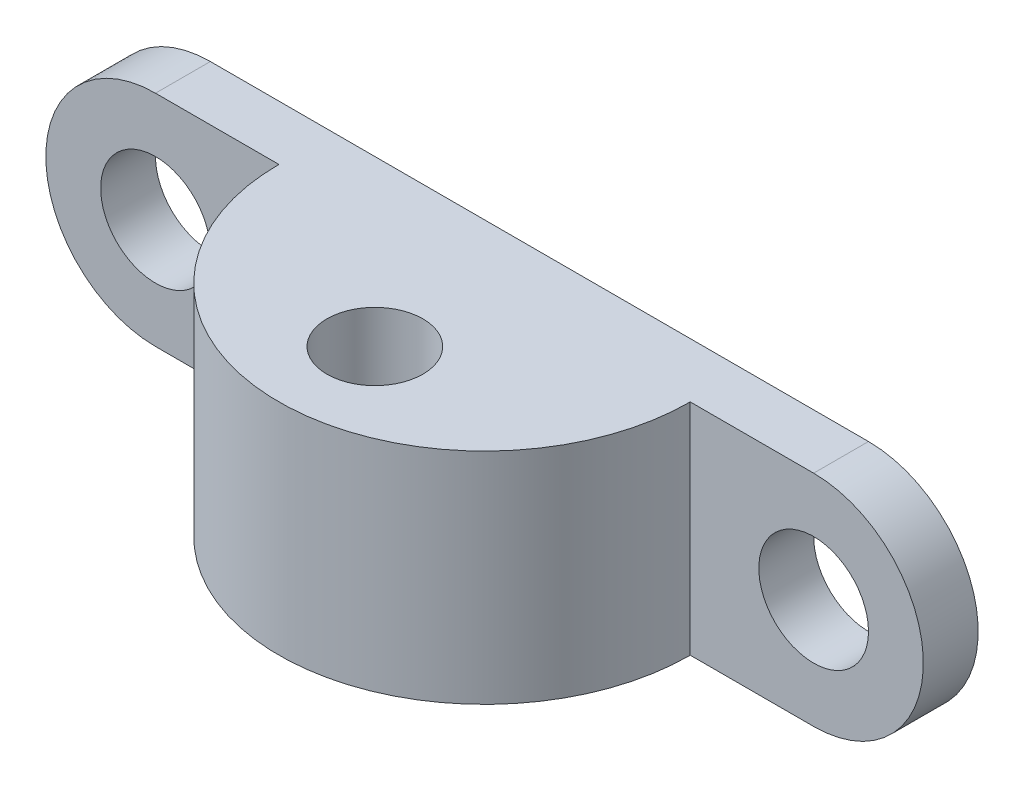
ISO-10303-21;
HEADER;
FILE_DESCRIPTION(('STEP AP214'),'2;1');
FILE_NAME('part.step','',(''),(''),'','','');
FILE_SCHEMA(('AUTOMOTIVE_DESIGN { 1 0 10303 214 1 1 1 1 }'));
ENDSEC;
DATA;
#1=APPLICATION_CONTEXT('core data for automotive mechanical design processes');
#2=APPLICATION_PROTOCOL_DEFINITION('international standard','automotive_design',2000,#1);
#3=PRODUCT_CONTEXT('',#1,'mechanical');
#4=PRODUCT('Part','Part','',(#3));
#5=PRODUCT_RELATED_PRODUCT_CATEGORY('part','',(#4));
#6=PRODUCT_DEFINITION_FORMATION('','',#4);
#7=PRODUCT_DEFINITION_CONTEXT('part definition',#1,'design');
#8=PRODUCT_DEFINITION('design','',#6,#7);
#9=PRODUCT_DEFINITION_SHAPE('','',#8);
#10=(LENGTH_UNIT() NAMED_UNIT(*) SI_UNIT(.MILLI.,.METRE.));
#11=(NAMED_UNIT(*) PLANE_ANGLE_UNIT() SI_UNIT($,.RADIAN.));
#12=(NAMED_UNIT(*) SI_UNIT($,.STERADIAN.) SOLID_ANGLE_UNIT());
#13=UNCERTAINTY_MEASURE_WITH_UNIT(LENGTH_MEASURE(1.E-05),#10,'distance_accuracy_value','');
#14=(GEOMETRIC_REPRESENTATION_CONTEXT(3) GLOBAL_UNCERTAINTY_ASSIGNED_CONTEXT((#13)) GLOBAL_UNIT_ASSIGNED_CONTEXT((#10,
#11,#12)) REPRESENTATION_CONTEXT('',''));
#15=CARTESIAN_POINT('',(0.,0.,0.));
#16=DIRECTION('',(0.,0.,1.));
#17=DIRECTION('',(1.,0.,0.));
#18=AXIS2_PLACEMENT_3D('',#15,#16,#17);
#19=CARTESIAN_POINT('',(0.,0.,2.));
#20=DIRECTION('',(0.,0.,1.));
#21=DIRECTION('',(1.,0.,0.));
#22=AXIS2_PLACEMENT_3D('',#19,#20,#21);
#23=PLANE('',#22);
#24=CARTESIAN_POINT('',(0.,0.,2.));
#25=DIRECTION('',(0.,0.,1.));
#26=DIRECTION('',(1.,0.,0.));
#27=AXIS2_PLACEMENT_3D('',#24,#25,#26);
#28=CIRCLE('',#27,2.);
#29=CARTESIAN_POINT('',(2.,0.,2.));
#30=VERTEX_POINT('',#29);
#31=EDGE_CURVE('E218',#30,#30,#28,.T.);
#32=ORIENTED_EDGE('',*,*,#31,.F.);
#33=EDGE_LOOP('',(#32));
#34=FACE_BOUND('',#33,.T.);
#35=CARTESIAN_POINT('',(0.,0.,2.));
#36=DIRECTION('',(0.,0.,1.));
#37=DIRECTION('',(1.,0.,0.));
#38=AXIS2_PLACEMENT_3D('',#35,#36,#37);
#39=CIRCLE('',#38,4.);
#40=CARTESIAN_POINT('',(0.,4.,2.));
#41=VERTEX_POINT('',#40);
#42=CARTESIAN_POINT('',(0.,-4.,2.));
#43=VERTEX_POINT('',#42);
#44=EDGE_CURVE('E173',#41,#43,#39,.T.);
#45=ORIENTED_EDGE('',*,*,#44,.T.);
#46=DIRECTION('',(1.,0.,0.));
#47=VECTOR('',#46,1.);
#48=CARTESIAN_POINT('',(0.,-4.,2.));
#49=LINE('',#48,#47);
#50=CARTESIAN_POINT('',(4.5,-4.,2.));
#51=VERTEX_POINT('',#50);
#52=EDGE_CURVE('E141',#43,#51,#49,.T.);
#53=ORIENTED_EDGE('',*,*,#52,.T.);
#54=DIRECTION('',(0.,-1.,0.));
#55=VECTOR('',#54,1.);
#56=CARTESIAN_POINT('',(4.5,29.8118189982806,2.));
#57=LINE('',#56,#55);
#58=CARTESIAN_POINT('',(4.5,4.,2.));
#59=VERTEX_POINT('',#58);
#60=EDGE_CURVE('E129',#59,#51,#57,.T.);
#61=ORIENTED_EDGE('',*,*,#60,.F.);
#62=DIRECTION('',(1.,0.,0.));
#63=VECTOR('',#62,1.);
#64=CARTESIAN_POINT('',(0.,4.,2.));
#65=LINE('',#64,#63);
#66=EDGE_CURVE('E140',#41,#59,#65,.T.);
#67=ORIENTED_EDGE('',*,*,#66,.F.);
#68=EDGE_LOOP('',(#45,#53,#61,#67));
#69=FACE_BOUND('',#68,.T.);
#70=ADVANCED_FACE('F71',(#34,#69),#23,.T.);
#71=CARTESIAN_POINT('',(0.,-4.,2.));
#72=DIRECTION('',(0.,1.,0.));
#73=DIRECTION('',(0.,0.,1.));
#74=AXIS2_PLACEMENT_3D('',#71,#72,#73);
#75=PLANE('',#74);
#76=DIRECTION('',(1.,0.,0.));
#77=VECTOR('',#76,1.);
#78=CARTESIAN_POINT('',(0.,-4.,0.));
#79=LINE('',#78,#77);
#80=CARTESIAN_POINT('',(0.,-4.,0.));
#81=VERTEX_POINT('',#80);
#82=CARTESIAN_POINT('',(24.,-4.,0.));
#83=VERTEX_POINT('',#82);
#84=EDGE_CURVE('E161',#81,#83,#79,.T.);
#85=ORIENTED_EDGE('',*,*,#84,.T.);
#86=DIRECTION('',(0.,0.,-1.));
#87=VECTOR('',#86,1.);
#88=CARTESIAN_POINT('',(24.,-4.,2.));
#89=LINE('',#88,#87);
#90=CARTESIAN_POINT('',(24.,-4.,2.));
#91=VERTEX_POINT('',#90);
#92=EDGE_CURVE('E80',#91,#83,#89,.T.);
#93=ORIENTED_EDGE('',*,*,#92,.F.);
#94=CARTESIAN_POINT('',(19.5,-4.,2.));
#95=VERTEX_POINT('',#94);
#96=EDGE_CURVE('E193',#95,#91,#49,.T.);
#97=ORIENTED_EDGE('',*,*,#96,.F.);
#98=CARTESIAN_POINT('',(12.,-4.,2.));
#99=DIRECTION('',(0.,-1.,0.));
#100=DIRECTION('',(0.,0.,-1.));
#101=AXIS2_PLACEMENT_3D('',#98,#99,#100);
#102=CIRCLE('',#101,7.5);
#103=EDGE_CURVE('E143',#95,#51,#102,.T.);
#104=ORIENTED_EDGE('',*,*,#103,.T.);
#105=ORIENTED_EDGE('',*,*,#52,.F.);
#106=DIRECTION('',(0.,0.,-1.));
#107=VECTOR('',#106,1.);
#108=CARTESIAN_POINT('',(0.,-4.,2.));
#109=LINE('',#108,#107);
#110=EDGE_CURVE('E12',#43,#81,#109,.T.);
#111=ORIENTED_EDGE('',*,*,#110,.T.);
#112=EDGE_LOOP('',(#85,#93,#97,#104,#105,#111));
#113=FACE_BOUND('',#112,.T.);
#114=CARTESIAN_POINT('',(12.,-4.,6.));
#115=DIRECTION('',(0.,-1.,0.));
#116=DIRECTION('',(0.,0.,-1.));
#117=AXIS2_PLACEMENT_3D('',#114,#115,#116);
#118=CIRCLE('',#117,1.75);
#119=CARTESIAN_POINT('',(12.,-4.,4.25));
#120=VERTEX_POINT('',#119);
#121=EDGE_CURVE('E133',#120,#120,#118,.T.);
#122=ORIENTED_EDGE('',*,*,#121,.F.);
#123=EDGE_LOOP('',(#122));
#124=FACE_BOUND('',#123,.T.);
#125=ADVANCED_FACE('F187',(#113,#124),#75,.F.);
#126=CARTESIAN_POINT('',(0.,4.,2.));
#127=DIRECTION('',(0.,1.,0.));
#128=DIRECTION('',(0.,0.,1.));
#129=AXIS2_PLACEMENT_3D('',#126,#127,#128);
#130=PLANE('',#129);
#131=DIRECTION('',(1.,0.,0.));
#132=VECTOR('',#131,1.);
#133=CARTESIAN_POINT('',(0.,4.,0.));
#134=LINE('',#133,#132);
#135=CARTESIAN_POINT('',(0.,4.,0.));
#136=VERTEX_POINT('',#135);
#137=CARTESIAN_POINT('',(24.,4.,0.));
#138=VERTEX_POINT('',#137);
#139=EDGE_CURVE('E170',#136,#138,#134,.T.);
#140=ORIENTED_EDGE('',*,*,#139,.F.);
#141=DIRECTION('',(0.,0.,-1.));
#142=VECTOR('',#141,1.);
#143=CARTESIAN_POINT('',(0.,4.,2.));
#144=LINE('',#143,#142);
#145=EDGE_CURVE('E96',#41,#136,#144,.T.);
#146=ORIENTED_EDGE('',*,*,#145,.F.);
#147=ORIENTED_EDGE('',*,*,#66,.T.);
#148=CARTESIAN_POINT('',(12.,4.,2.));
#149=DIRECTION('',(0.,1.,0.));
#150=DIRECTION('',(0.,0.,1.));
#151=AXIS2_PLACEMENT_3D('',#148,#149,#150);
#152=CIRCLE('',#151,7.5);
#153=CARTESIAN_POINT('',(19.5,4.,2.));
#154=VERTEX_POINT('',#153);
#155=EDGE_CURVE('E126',#154,#59,#152,.F.);
#156=ORIENTED_EDGE('',*,*,#155,.F.);
#157=CARTESIAN_POINT('',(24.,4.,2.));
#158=VERTEX_POINT('',#157);
#159=EDGE_CURVE('E148',#154,#158,#65,.T.);
#160=ORIENTED_EDGE('',*,*,#159,.T.);
#161=DIRECTION('',(0.,0.,-1.));
#162=VECTOR('',#161,1.);
#163=CARTESIAN_POINT('',(24.,4.,2.));
#164=LINE('',#163,#162);
#165=EDGE_CURVE('E152',#158,#138,#164,.T.);
#166=ORIENTED_EDGE('',*,*,#165,.T.);
#167=EDGE_LOOP('',(#140,#146,#147,#156,#160,#166));
#168=FACE_BOUND('',#167,.T.);
#169=CARTESIAN_POINT('',(12.,4.,6.));
#170=DIRECTION('',(0.,1.,0.));
#171=DIRECTION('',(0.,0.,1.));
#172=AXIS2_PLACEMENT_3D('',#169,#170,#171);
#173=CIRCLE('',#172,1.75);
#174=CARTESIAN_POINT('',(12.,4.,7.75));
#175=VERTEX_POINT('',#174);
#176=EDGE_CURVE('E162',#175,#175,#173,.F.);
#177=ORIENTED_EDGE('',*,*,#176,.T.);
#178=EDGE_LOOP('',(#177));
#179=FACE_BOUND('',#178,.T.);
#180=ADVANCED_FACE('F145',(#168,#179),#130,.T.);
#181=CARTESIAN_POINT('',(24.,0.,2.));
#182=DIRECTION('',(0.,0.,-1.));
#183=DIRECTION('',(-1.,0.,0.));
#184=AXIS2_PLACEMENT_3D('',#181,#182,#183);
#185=CYLINDRICAL_SURFACE('',#184,4.00000000000001);
#186=CARTESIAN_POINT('',(24.,0.,0.));
#187=DIRECTION('',(0.,0.,1.));
#188=DIRECTION('',(1.,0.,0.));
#189=AXIS2_PLACEMENT_3D('',#186,#187,#188);
#190=CIRCLE('',#189,4.00000000000001);
#191=EDGE_CURVE('E166',#83,#138,#190,.T.);
#192=ORIENTED_EDGE('',*,*,#191,.T.);
#193=ORIENTED_EDGE('',*,*,#165,.F.);
#194=CARTESIAN_POINT('',(24.,0.,2.));
#195=DIRECTION('',(0.,0.,1.));
#196=DIRECTION('',(1.,0.,0.));
#197=AXIS2_PLACEMENT_3D('',#194,#195,#196);
#198=CIRCLE('',#197,4.00000000000001);
#199=EDGE_CURVE('E154',#91,#158,#198,.T.);
#200=ORIENTED_EDGE('',*,*,#199,.F.);
#201=ORIENTED_EDGE('',*,*,#92,.T.);
#202=EDGE_LOOP('',(#192,#193,#200,#201));
#203=FACE_BOUND('',#202,.T.);
#204=ADVANCED_FACE('F180',(#203),#185,.T.);
#205=CARTESIAN_POINT('',(0.,0.,0.));
#206=DIRECTION('',(0.,0.,1.));
#207=DIRECTION('',(1.,0.,0.));
#208=AXIS2_PLACEMENT_3D('',#205,#206,#207);
#209=PLANE('',#208);
#210=CARTESIAN_POINT('',(0.,0.,0.));
#211=DIRECTION('',(0.,0.,1.));
#212=DIRECTION('',(1.,0.,0.));
#213=AXIS2_PLACEMENT_3D('',#210,#211,#212);
#214=CIRCLE('',#213,2.);
#215=CARTESIAN_POINT('',(2.,0.,0.));
#216=VERTEX_POINT('',#215);
#217=EDGE_CURVE('E134',#216,#216,#214,.T.);
#218=ORIENTED_EDGE('',*,*,#217,.T.);
#219=EDGE_LOOP('',(#218));
#220=FACE_BOUND('',#219,.T.);
#221=CARTESIAN_POINT('',(24.,0.,0.));
#222=DIRECTION('',(0.,0.,1.));
#223=DIRECTION('',(1.,0.,0.));
#224=AXIS2_PLACEMENT_3D('',#221,#222,#223);
#225=CIRCLE('',#224,2.);
#226=CARTESIAN_POINT('',(26.,0.,0.));
#227=VERTEX_POINT('',#226);
#228=EDGE_CURVE('E210',#227,#227,#225,.T.);
#229=ORIENTED_EDGE('',*,*,#228,.T.);
#230=EDGE_LOOP('',(#229));
#231=FACE_BOUND('',#230,.T.);
#232=ORIENTED_EDGE('',*,*,#191,.F.);
#233=ORIENTED_EDGE('',*,*,#84,.F.);
#234=CARTESIAN_POINT('',(0.,0.,0.));
#235=DIRECTION('',(0.,0.,1.));
#236=DIRECTION('',(1.,0.,0.));
#237=AXIS2_PLACEMENT_3D('',#234,#235,#236);
#238=CIRCLE('',#237,4.);
#239=EDGE_CURVE('E158',#136,#81,#238,.T.);
#240=ORIENTED_EDGE('',*,*,#239,.F.);
#241=ORIENTED_EDGE('',*,*,#139,.T.);
#242=EDGE_LOOP('',(#232,#233,#240,#241));
#243=FACE_BOUND('',#242,.T.);
#244=ADVANCED_FACE('F190',(#220,#231,#243),#209,.F.);
#245=CARTESIAN_POINT('',(24.,0.,2.));
#246=DIRECTION('',(0.,0.,1.));
#247=DIRECTION('',(1.,0.,0.));
#248=AXIS2_PLACEMENT_3D('',#245,#246,#247);
#249=CIRCLE('',#248,2.);
#250=CARTESIAN_POINT('',(26.,0.,2.));
#251=VERTEX_POINT('',#250);
#252=EDGE_CURVE('E214',#251,#251,#249,.T.);
#253=ORIENTED_EDGE('',*,*,#252,.F.);
#254=EDGE_LOOP('',(#253));
#255=FACE_BOUND('',#254,.T.);
#256=ORIENTED_EDGE('',*,*,#199,.T.);
#257=ORIENTED_EDGE('',*,*,#159,.F.);
#258=DIRECTION('',(0.,-1.,0.));
#259=VECTOR('',#258,1.);
#260=CARTESIAN_POINT('',(19.5,29.8118189982806,2.));
#261=LINE('',#260,#259);
#262=EDGE_CURVE('E87',#154,#95,#261,.T.);
#263=ORIENTED_EDGE('',*,*,#262,.T.);
#264=ORIENTED_EDGE('',*,*,#96,.T.);
#265=EDGE_LOOP('',(#256,#257,#263,#264));
#266=FACE_BOUND('',#265,.T.);
#267=ADVANCED_FACE('F192',(#255,#266),#23,.T.);
#268=CARTESIAN_POINT('',(0.,0.,2.));
#269=DIRECTION('',(0.,0.,-1.));
#270=DIRECTION('',(-1.,0.,0.));
#271=AXIS2_PLACEMENT_3D('',#268,#269,#270);
#272=CYLINDRICAL_SURFACE('',#271,4.);
#273=ORIENTED_EDGE('',*,*,#239,.T.);
#274=ORIENTED_EDGE('',*,*,#110,.F.);
#275=ORIENTED_EDGE('',*,*,#44,.F.);
#276=ORIENTED_EDGE('',*,*,#145,.T.);
#277=EDGE_LOOP('',(#273,#274,#275,#276));
#278=FACE_BOUND('',#277,.T.);
#279=ADVANCED_FACE('F73',(#278),#272,.T.);
#280=CARTESIAN_POINT('',(12.,29.8118189982806,6.));
#281=DIRECTION('',(0.,-1.,0.));
#282=DIRECTION('',(0.,0.,-1.));
#283=AXIS2_PLACEMENT_3D('',#280,#281,#282);
#284=CYLINDRICAL_SURFACE('',#283,1.75);
#285=ORIENTED_EDGE('',*,*,#121,.T.);
#286=EDGE_LOOP('',(#285));
#287=FACE_BOUND('',#286,.T.);
#288=ORIENTED_EDGE('',*,*,#176,.F.);
#289=EDGE_LOOP('',(#288));
#290=FACE_BOUND('',#289,.T.);
#291=ADVANCED_FACE('F253',(#287,#290),#284,.F.);
#292=CARTESIAN_POINT('',(12.,29.8118189982806,2.));
#293=DIRECTION('',(0.,-1.,0.));
#294=DIRECTION('',(0.,0.,-1.));
#295=AXIS2_PLACEMENT_3D('',#292,#293,#294);
#296=CYLINDRICAL_SURFACE('',#295,7.5);
#297=ORIENTED_EDGE('',*,*,#262,.F.);
#298=ORIENTED_EDGE('',*,*,#155,.T.);
#299=ORIENTED_EDGE('',*,*,#60,.T.);
#300=ORIENTED_EDGE('',*,*,#103,.F.);
#301=EDGE_LOOP('',(#297,#298,#299,#300));
#302=FACE_BOUND('',#301,.T.);
#303=ADVANCED_FACE('F128',(#302),#296,.T.);
#304=CARTESIAN_POINT('',(24.,0.,0.));
#305=DIRECTION('',(0.,0.,1.));
#306=DIRECTION('',(1.,0.,0.));
#307=AXIS2_PLACEMENT_3D('',#304,#305,#306);
#308=CYLINDRICAL_SURFACE('',#307,2.);
#309=ORIENTED_EDGE('',*,*,#228,.F.);
#310=EDGE_LOOP('',(#309));
#311=FACE_BOUND('',#310,.T.);
#312=ORIENTED_EDGE('',*,*,#252,.T.);
#313=EDGE_LOOP('',(#312));
#314=FACE_BOUND('',#313,.T.);
#315=ADVANCED_FACE('F231',(#311,#314),#308,.F.);
#316=CARTESIAN_POINT('',(0.,0.,0.));
#317=DIRECTION('',(0.,0.,1.));
#318=DIRECTION('',(1.,0.,0.));
#319=AXIS2_PLACEMENT_3D('',#316,#317,#318);
#320=CYLINDRICAL_SURFACE('',#319,2.);
#321=ORIENTED_EDGE('',*,*,#217,.F.);
#322=EDGE_LOOP('',(#321));
#323=FACE_BOUND('',#322,.T.);
#324=ORIENTED_EDGE('',*,*,#31,.T.);
#325=EDGE_LOOP('',(#324));
#326=FACE_BOUND('',#325,.T.);
#327=ADVANCED_FACE('F228',(#323,#326),#320,.F.);
#328=CLOSED_SHELL('',(#70,#125,#180,#204,#244,#267,#279,#291,#303,#315,#327));
#329=MANIFOLD_SOLID_BREP('B2',#328);
#330=ADVANCED_BREP_SHAPE_REPRESENTATION('',(#18,#329),#14);
#331=SHAPE_DEFINITION_REPRESENTATION(#9,#330);
ENDSEC;
END-ISO-10303-21;
